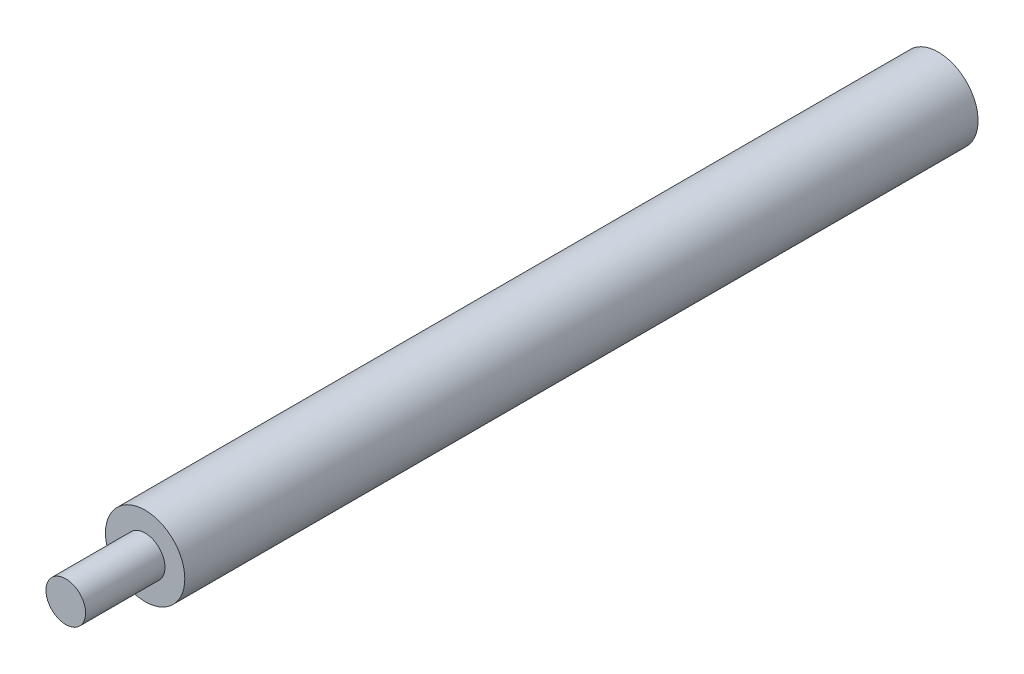
ISO-10303-21;
HEADER;
FILE_DESCRIPTION(('STEP AP214'),'2;1');
FILE_NAME('part.step','',(''),(''),'','','');
FILE_SCHEMA(('AUTOMOTIVE_DESIGN { 1 0 10303 214 1 1 1 1 }'));
ENDSEC;
DATA;
#1=APPLICATION_CONTEXT('core data for automotive mechanical design processes');
#2=APPLICATION_PROTOCOL_DEFINITION('international standard','automotive_design',2000,#1);
#3=PRODUCT_CONTEXT('',#1,'mechanical');
#4=PRODUCT('Part','Part','',(#3));
#5=PRODUCT_RELATED_PRODUCT_CATEGORY('part','',(#4));
#6=PRODUCT_DEFINITION_FORMATION('','',#4);
#7=PRODUCT_DEFINITION_CONTEXT('part definition',#1,'design');
#8=PRODUCT_DEFINITION('design','',#6,#7);
#9=PRODUCT_DEFINITION_SHAPE('','',#8);
#10=(LENGTH_UNIT() NAMED_UNIT(*) SI_UNIT(.MILLI.,.METRE.));
#11=(NAMED_UNIT(*) PLANE_ANGLE_UNIT() SI_UNIT($,.RADIAN.));
#12=(NAMED_UNIT(*) SI_UNIT($,.STERADIAN.) SOLID_ANGLE_UNIT());
#13=UNCERTAINTY_MEASURE_WITH_UNIT(LENGTH_MEASURE(1.E-05),#10,'distance_accuracy_value','');
#14=(GEOMETRIC_REPRESENTATION_CONTEXT(3) GLOBAL_UNCERTAINTY_ASSIGNED_CONTEXT((#13)) GLOBAL_UNIT_ASSIGNED_CONTEXT((#10,
#11,#12)) REPRESENTATION_CONTEXT('',''));
#15=CARTESIAN_POINT('',(0.,0.,0.));
#16=DIRECTION('',(0.,0.,1.));
#17=DIRECTION('',(1.,0.,0.));
#18=AXIS2_PLACEMENT_3D('',#15,#16,#17);
#19=CARTESIAN_POINT('',(0.,0.,60.));
#20=DIRECTION('',(0.,0.,-1.));
#21=DIRECTION('',(-1.,0.,0.));
#22=AXIS2_PLACEMENT_3D('',#19,#20,#21);
#23=CYLINDRICAL_SURFACE('',#22,2.5);
#24=CARTESIAN_POINT('',(0.,0.,60.));
#25=DIRECTION('',(0.,0.,1.));
#26=DIRECTION('',(1.,0.,0.));
#27=AXIS2_PLACEMENT_3D('',#24,#25,#26);
#28=CIRCLE('',#27,2.5);
#29=CARTESIAN_POINT('',(2.5,0.,60.));
#30=VERTEX_POINT('',#29);
#31=EDGE_CURVE('E44',#30,#30,#28,.T.);
#32=ORIENTED_EDGE('',*,*,#31,.F.);
#33=EDGE_LOOP('',(#32));
#34=FACE_BOUND('',#33,.T.);
#35=CARTESIAN_POINT('',(0.,0.,10.));
#36=DIRECTION('',(0.,0.,-1.));
#37=DIRECTION('',(-1.,0.,0.));
#38=AXIS2_PLACEMENT_3D('',#35,#36,#37);
#39=CIRCLE('',#38,2.5);
#40=CARTESIAN_POINT('',(-2.5,0.,10.));
#41=VERTEX_POINT('',#40);
#42=EDGE_CURVE('E40',#41,#41,#39,.T.);
#43=ORIENTED_EDGE('',*,*,#42,.F.);
#44=EDGE_LOOP('',(#43));
#45=FACE_BOUND('',#44,.T.);
#46=ADVANCED_FACE('F37',(#34,#45),#23,.T.);
#47=CARTESIAN_POINT('',(0.,0.,60.));
#48=DIRECTION('',(0.,0.,1.));
#49=DIRECTION('',(1.,0.,0.));
#50=AXIS2_PLACEMENT_3D('',#47,#48,#49);
#51=PLANE('',#50);
#52=CARTESIAN_POINT('',(0.,0.,60.));
#53=DIRECTION('',(0.,0.,1.));
#54=DIRECTION('',(1.,0.,0.));
#55=AXIS2_PLACEMENT_3D('',#52,#53,#54);
#56=CIRCLE('',#55,1.25);
#57=CARTESIAN_POINT('',(1.25,0.,60.));
#58=VERTEX_POINT('',#57);
#59=EDGE_CURVE('E10',#58,#58,#56,.T.);
#60=ORIENTED_EDGE('',*,*,#59,.F.);
#61=EDGE_LOOP('',(#60));
#62=FACE_BOUND('',#61,.T.);
#63=ORIENTED_EDGE('',*,*,#31,.T.);
#64=EDGE_LOOP('',(#63));
#65=FACE_BOUND('',#64,.T.);
#66=ADVANCED_FACE('F66',(#62,#65),#51,.T.);
#67=CARTESIAN_POINT('',(0.,0.,65.));
#68=DIRECTION('',(0.,0.,-1.));
#69=DIRECTION('',(-1.,0.,0.));
#70=AXIS2_PLACEMENT_3D('',#67,#68,#69);
#71=CYLINDRICAL_SURFACE('',#70,1.25);
#72=CARTESIAN_POINT('',(0.,0.,65.));
#73=DIRECTION('',(0.,0.,1.));
#74=DIRECTION('',(1.,0.,0.));
#75=AXIS2_PLACEMENT_3D('',#72,#73,#74);
#76=CIRCLE('',#75,1.25);
#77=CARTESIAN_POINT('',(1.25,0.,65.));
#78=VERTEX_POINT('',#77);
#79=EDGE_CURVE('E49',#78,#78,#76,.T.);
#80=ORIENTED_EDGE('',*,*,#79,.F.);
#81=EDGE_LOOP('',(#80));
#82=FACE_BOUND('',#81,.T.);
#83=ORIENTED_EDGE('',*,*,#59,.T.);
#84=EDGE_LOOP('',(#83));
#85=FACE_BOUND('',#84,.T.);
#86=ADVANCED_FACE('F71',(#82,#85),#71,.T.);
#87=CARTESIAN_POINT('',(0.,0.,65.));
#88=DIRECTION('',(0.,0.,1.));
#89=DIRECTION('',(1.,0.,0.));
#90=AXIS2_PLACEMENT_3D('',#87,#88,#89);
#91=PLANE('',#90);
#92=ORIENTED_EDGE('',*,*,#79,.T.);
#93=EDGE_LOOP('',(#92));
#94=FACE_BOUND('',#93,.T.);
#95=ADVANCED_FACE('F78',(#94),#91,.T.);
#96=CARTESIAN_POINT('',(0.,0.,10.));
#97=DIRECTION('',(0.,0.,-1.));
#98=DIRECTION('',(-1.,0.,0.));
#99=AXIS2_PLACEMENT_3D('',#96,#97,#98);
#100=PLANE('',#99);
#101=CARTESIAN_POINT('',(0.,0.,10.));
#102=DIRECTION('',(0.,0.,-1.));
#103=DIRECTION('',(-1.,0.,0.));
#104=AXIS2_PLACEMENT_3D('',#101,#102,#103);
#105=CIRCLE('',#104,1.25);
#106=CARTESIAN_POINT('',(-1.25,0.,10.));
#107=VERTEX_POINT('',#106);
#108=EDGE_CURVE('E53',#107,#107,#105,.T.);
#109=ORIENTED_EDGE('',*,*,#108,.F.);
#110=EDGE_LOOP('',(#109));
#111=FACE_BOUND('',#110,.T.);
#112=ORIENTED_EDGE('',*,*,#42,.T.);
#113=EDGE_LOOP('',(#112));
#114=FACE_BOUND('',#113,.T.);
#115=ADVANCED_FACE('F63',(#111,#114),#100,.T.);
#116=CARTESIAN_POINT('',(0.,0.,15.));
#117=DIRECTION('',(0.,0.,-1.));
#118=DIRECTION('',(-1.,0.,0.));
#119=AXIS2_PLACEMENT_3D('',#116,#117,#118);
#120=CYLINDRICAL_SURFACE('',#119,1.25);
#121=CARTESIAN_POINT('',(0.,0.,15.));
#122=DIRECTION('',(0.,0.,-1.));
#123=DIRECTION('',(-1.,0.,0.));
#124=AXIS2_PLACEMENT_3D('',#121,#122,#123);
#125=CIRCLE('',#124,1.25);
#126=CARTESIAN_POINT('',(-1.25,0.,15.));
#127=VERTEX_POINT('',#126);
#128=EDGE_CURVE('E56',#127,#127,#125,.T.);
#129=ORIENTED_EDGE('',*,*,#128,.F.);
#130=EDGE_LOOP('',(#129));
#131=FACE_BOUND('',#130,.T.);
#132=ORIENTED_EDGE('',*,*,#108,.T.);
#133=EDGE_LOOP('',(#132));
#134=FACE_BOUND('',#133,.T.);
#135=ADVANCED_FACE('F87',(#131,#134),#120,.F.);
#136=CARTESIAN_POINT('',(0.,0.,15.));
#137=DIRECTION('',(0.,0.,-1.));
#138=DIRECTION('',(-1.,0.,0.));
#139=AXIS2_PLACEMENT_3D('',#136,#137,#138);
#140=PLANE('',#139);
#141=ORIENTED_EDGE('',*,*,#128,.T.);
#142=EDGE_LOOP('',(#141));
#143=FACE_BOUND('',#142,.T.);
#144=ADVANCED_FACE('F91',(#143),#140,.T.);
#145=CLOSED_SHELL('',(#46,#66,#86,#95,#115,#135,#144));
#146=MANIFOLD_SOLID_BREP('B2',#145);
#147=ADVANCED_BREP_SHAPE_REPRESENTATION('',(#18,#146),#14);
#148=SHAPE_DEFINITION_REPRESENTATION(#9,#147);
ENDSEC;
END-ISO-10303-21;
